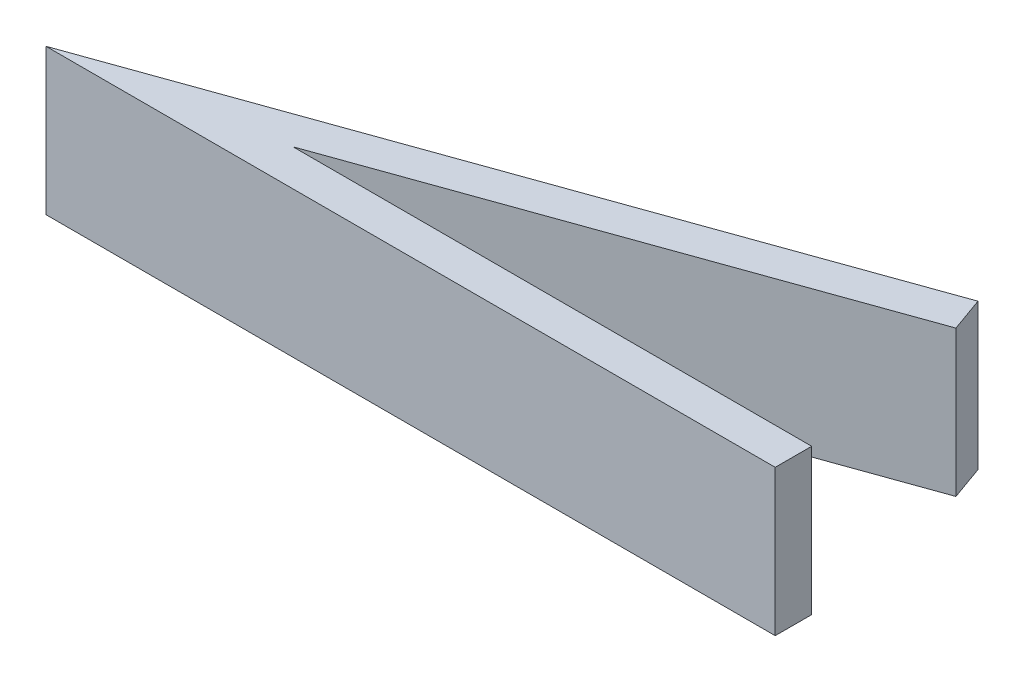
ISO-10303-21;
HEADER;
FILE_DESCRIPTION(('STEP AP214'),'2;1');
FILE_NAME('part.step','',(''),(''),'','','');
FILE_SCHEMA(('AUTOMOTIVE_DESIGN { 1 0 10303 214 1 1 1 1 }'));
ENDSEC;
DATA;
#1=APPLICATION_CONTEXT('core data for automotive mechanical design processes');
#2=APPLICATION_PROTOCOL_DEFINITION('international standard','automotive_design',2000,#1);
#3=PRODUCT_CONTEXT('',#1,'mechanical');
#4=PRODUCT('Part','Part','',(#3));
#5=PRODUCT_RELATED_PRODUCT_CATEGORY('part','',(#4));
#6=PRODUCT_DEFINITION_FORMATION('','',#4);
#7=PRODUCT_DEFINITION_CONTEXT('part definition',#1,'design');
#8=PRODUCT_DEFINITION('design','',#6,#7);
#9=PRODUCT_DEFINITION_SHAPE('','',#8);
#10=(LENGTH_UNIT() NAMED_UNIT(*) SI_UNIT(.MILLI.,.METRE.));
#11=(NAMED_UNIT(*) PLANE_ANGLE_UNIT() SI_UNIT($,.RADIAN.));
#12=(NAMED_UNIT(*) SI_UNIT($,.STERADIAN.) SOLID_ANGLE_UNIT());
#13=UNCERTAINTY_MEASURE_WITH_UNIT(LENGTH_MEASURE(1.E-05),#10,'distance_accuracy_value','');
#14=(GEOMETRIC_REPRESENTATION_CONTEXT(3) GLOBAL_UNCERTAINTY_ASSIGNED_CONTEXT((#13)) GLOBAL_UNIT_ASSIGNED_CONTEXT((#10,
#11,#12)) REPRESENTATION_CONTEXT('',''));
#15=CARTESIAN_POINT('',(0.,0.,0.));
#16=DIRECTION('',(0.,0.,1.));
#17=DIRECTION('',(1.,0.,0.));
#18=AXIS2_PLACEMENT_3D('',#15,#16,#17);
#19=CARTESIAN_POINT('',(0.,20.,0.));
#20=DIRECTION('',(0.,0.,-1.));
#21=DIRECTION('',(-1.,0.,0.));
#22=AXIS2_PLACEMENT_3D('',#19,#20,#21);
#23=PLANE('',#22);
#24=DIRECTION('',(1.,0.,0.));
#25=VECTOR('',#24,1.);
#26=CARTESIAN_POINT('',(0.,0.,0.));
#27=LINE('',#26,#25);
#28=CARTESIAN_POINT('',(-37.3203229951522,0.,0.));
#29=VERTEX_POINT('',#28);
#30=CARTESIAN_POINT('',(62.6796770048478,0.,0.));
#31=VERTEX_POINT('',#30);
#32=EDGE_CURVE('E83',#29,#31,#27,.T.);
#33=ORIENTED_EDGE('',*,*,#32,.T.);
#34=DIRECTION('',(0.,-1.,0.));
#35=VECTOR('',#34,1.);
#36=CARTESIAN_POINT('',(62.6796770048478,20.,0.));
#37=LINE('',#36,#35);
#38=CARTESIAN_POINT('',(62.6796770048478,20.,0.));
#39=VERTEX_POINT('',#38);
#40=EDGE_CURVE('E11',#39,#31,#37,.T.);
#41=ORIENTED_EDGE('',*,*,#40,.F.);
#42=DIRECTION('',(1.,0.,0.));
#43=VECTOR('',#42,1.);
#44=CARTESIAN_POINT('',(-37.3203229951522,20.,0.));
#45=LINE('',#44,#43);
#46=CARTESIAN_POINT('',(-37.3203229951522,20.,0.));
#47=VERTEX_POINT('',#46);
#48=EDGE_CURVE('E89',#47,#39,#45,.T.);
#49=ORIENTED_EDGE('',*,*,#48,.F.);
#50=DIRECTION('',(0.,-1.,0.));
#51=VECTOR('',#50,1.);
#52=CARTESIAN_POINT('',(-37.3203229951522,20.,0.));
#53=LINE('',#52,#51);
#54=EDGE_CURVE('E117',#47,#29,#53,.T.);
#55=ORIENTED_EDGE('',*,*,#54,.T.);
#56=EDGE_LOOP('',(#33,#41,#49,#55));
#57=FACE_BOUND('',#56,.T.);
#58=ADVANCED_FACE('F37',(#57),#23,.F.);
#59=CARTESIAN_POINT('',(62.6796770048478,20.,0.));
#60=DIRECTION('',(-1.,0.,0.));
#61=DIRECTION('',(0.,0.,1.));
#62=AXIS2_PLACEMENT_3D('',#59,#60,#61);
#63=PLANE('',#62);
#64=DIRECTION('',(0.,0.,-1.));
#65=VECTOR('',#64,1.);
#66=CARTESIAN_POINT('',(62.6796770048478,0.,0.));
#67=LINE('',#66,#65);
#68=CARTESIAN_POINT('',(62.6796770048478,0.,-5.));
#69=VERTEX_POINT('',#68);
#70=EDGE_CURVE('E122',#31,#69,#67,.T.);
#71=ORIENTED_EDGE('',*,*,#70,.T.);
#72=DIRECTION('',(0.,-1.,0.));
#73=VECTOR('',#72,1.);
#74=CARTESIAN_POINT('',(62.6796770048478,20.,-5.));
#75=LINE('',#74,#73);
#76=CARTESIAN_POINT('',(62.6796770048478,20.,-5.));
#77=VERTEX_POINT('',#76);
#78=EDGE_CURVE('E45',#77,#69,#75,.T.);
#79=ORIENTED_EDGE('',*,*,#78,.F.);
#80=DIRECTION('',(0.,0.,-1.));
#81=VECTOR('',#80,1.);
#82=CARTESIAN_POINT('',(62.6796770048478,20.,0.));
#83=LINE('',#82,#81);
#84=EDGE_CURVE('E144',#39,#77,#83,.T.);
#85=ORIENTED_EDGE('',*,*,#84,.F.);
#86=ORIENTED_EDGE('',*,*,#40,.T.);
#87=EDGE_LOOP('',(#71,#79,#85,#86));
#88=FACE_BOUND('',#87,.T.);
#89=ADVANCED_FACE('F147',(#88),#63,.F.);
#90=CARTESIAN_POINT('',(62.6796770048478,20.,-5.));
#91=DIRECTION('',(0.,0.,1.));
#92=DIRECTION('',(1.,0.,0.));
#93=AXIS2_PLACEMENT_3D('',#90,#91,#92);
#94=PLANE('',#93);
#95=DIRECTION('',(-1.,0.,0.));
#96=VECTOR('',#95,1.);
#97=CARTESIAN_POINT('',(62.6796770048478,0.,-5.));
#98=LINE('',#97,#96);
#99=CARTESIAN_POINT('',(-8.45425431066641,0.,-4.99999999999999));
#100=VERTEX_POINT('',#99);
#101=EDGE_CURVE('E124',#69,#100,#98,.T.);
#102=ORIENTED_EDGE('',*,*,#101,.T.);
#103=DIRECTION('',(0.,-1.,0.));
#104=VECTOR('',#103,1.);
#105=CARTESIAN_POINT('',(-8.45425431066641,20.,-4.99999999999999));
#106=LINE('',#105,#104);
#107=CARTESIAN_POINT('',(-8.45425431066641,20.,-4.99999999999999));
#108=VERTEX_POINT('',#107);
#109=EDGE_CURVE('E112',#108,#100,#106,.T.);
#110=ORIENTED_EDGE('',*,*,#109,.F.);
#111=DIRECTION('',(-1.,0.,0.));
#112=VECTOR('',#111,1.);
#113=CARTESIAN_POINT('',(62.6796770048478,20.,-5.));
#114=LINE('',#113,#112);
#115=EDGE_CURVE('E103',#77,#108,#114,.T.);
#116=ORIENTED_EDGE('',*,*,#115,.F.);
#117=ORIENTED_EDGE('',*,*,#78,.T.);
#118=EDGE_LOOP('',(#102,#110,#116,#117));
#119=FACE_BOUND('',#118,.T.);
#120=ADVANCED_FACE('F137',(#119),#94,.F.);
#121=CARTESIAN_POINT('',(-8.45425431066641,20.,-4.99999999999999));
#122=DIRECTION('',(-0.336336397687607,0.,-0.941741911348605));
#123=DIRECTION('',(-0.941741911348605,0.,0.336336397687607));
#124=AXIS2_PLACEMENT_3D('',#121,#122,#123);
#125=PLANE('',#124);
#126=DIRECTION('',(0.941741911348605,0.,-0.336336397687607));
#127=VECTOR('',#126,1.);
#128=CARTESIAN_POINT('',(-8.45425431066641,0.,-4.99999999999999));
#129=LINE('',#128,#127);
#130=CARTESIAN_POINT('',(58.5355501281463,0.,-28.9249302120177));
#131=VERTEX_POINT('',#130);
#132=EDGE_CURVE('E111',#100,#131,#129,.T.);
#133=ORIENTED_EDGE('',*,*,#132,.T.);
#134=DIRECTION('',(0.,-1.,0.));
#135=VECTOR('',#134,1.);
#136=CARTESIAN_POINT('',(58.5355501281463,20.,-28.9249302120177));
#137=LINE('',#136,#135);
#138=CARTESIAN_POINT('',(58.5355501281463,20.,-28.9249302120177));
#139=VERTEX_POINT('',#138);
#140=EDGE_CURVE('E108',#139,#131,#137,.T.);
#141=ORIENTED_EDGE('',*,*,#140,.F.);
#142=DIRECTION('',(0.941741911348605,0.,-0.336336397687607));
#143=VECTOR('',#142,1.);
#144=CARTESIAN_POINT('',(-8.45425431066641,20.,-4.99999999999999));
#145=LINE('',#144,#143);
#146=EDGE_CURVE('E97',#108,#139,#145,.T.);
#147=ORIENTED_EDGE('',*,*,#146,.F.);
#148=ORIENTED_EDGE('',*,*,#109,.T.);
#149=EDGE_LOOP('',(#133,#141,#147,#148));
#150=FACE_BOUND('',#149,.T.);
#151=ADVANCED_FACE('F109',(#150),#125,.F.);
#152=CARTESIAN_POINT('',(58.5355501281463,20.,-28.9249302120177));
#153=DIRECTION('',(-0.941741911348605,0.,0.336336397687607));
#154=DIRECTION('',(0.336336397687607,0.,0.941741911348605));
#155=AXIS2_PLACEMENT_3D('',#152,#153,#154);
#156=PLANE('',#155);
#157=DIRECTION('',(-0.336336397687607,0.,-0.941741911348605));
#158=VECTOR('',#157,1.);
#159=CARTESIAN_POINT('',(58.5355501281463,0.,-28.9249302120177));
#160=LINE('',#159,#158);
#161=CARTESIAN_POINT('',(56.8538681397083,0.,-33.6336397687608));
#162=VERTEX_POINT('',#161);
#163=EDGE_CURVE('E76',#131,#162,#160,.T.);
#164=ORIENTED_EDGE('',*,*,#163,.T.);
#165=DIRECTION('',(0.,-1.,0.));
#166=VECTOR('',#165,1.);
#167=CARTESIAN_POINT('',(56.8538681397083,20.,-33.6336397687608));
#168=LINE('',#167,#166);
#169=CARTESIAN_POINT('',(56.8538681397083,20.,-33.6336397687608));
#170=VERTEX_POINT('',#169);
#171=EDGE_CURVE('E113',#170,#162,#168,.T.);
#172=ORIENTED_EDGE('',*,*,#171,.F.);
#173=DIRECTION('',(-0.336336397687607,0.,-0.941741911348605));
#174=VECTOR('',#173,1.);
#175=CARTESIAN_POINT('',(58.5355501281463,20.,-28.9249302120177));
#176=LINE('',#175,#174);
#177=EDGE_CURVE('E101',#139,#170,#176,.T.);
#178=ORIENTED_EDGE('',*,*,#177,.F.);
#179=ORIENTED_EDGE('',*,*,#140,.T.);
#180=EDGE_LOOP('',(#164,#172,#178,#179));
#181=FACE_BOUND('',#180,.T.);
#182=ADVANCED_FACE('F115',(#181),#156,.F.);
#183=CARTESIAN_POINT('',(56.8538681397083,20.,-33.6336397687608));
#184=DIRECTION('',(0.336336397687608,0.,0.941741911348605));
#185=DIRECTION('',(0.941741911348605,0.,-0.336336397687608));
#186=AXIS2_PLACEMENT_3D('',#183,#184,#185);
#187=PLANE('',#186);
#188=DIRECTION('',(-0.941741911348605,0.,0.336336397687608));
#189=VECTOR('',#188,1.);
#190=CARTESIAN_POINT('',(56.8538681397083,0.,-33.6336397687608));
#191=LINE('',#190,#189);
#192=EDGE_CURVE('E128',#162,#29,#191,.T.);
#193=ORIENTED_EDGE('',*,*,#192,.T.);
#194=ORIENTED_EDGE('',*,*,#54,.F.);
#195=DIRECTION('',(-0.941741911348605,0.,0.336336397687608));
#196=VECTOR('',#195,1.);
#197=CARTESIAN_POINT('',(56.8538681397083,20.,-33.6336397687608));
#198=LINE('',#197,#196);
#199=EDGE_CURVE('E53',#170,#47,#198,.T.);
#200=ORIENTED_EDGE('',*,*,#199,.F.);
#201=ORIENTED_EDGE('',*,*,#171,.T.);
#202=EDGE_LOOP('',(#193,#194,#200,#201));
#203=FACE_BOUND('',#202,.T.);
#204=ADVANCED_FACE('F142',(#203),#187,.F.);
#205=CARTESIAN_POINT('',(0.,20.,0.));
#206=DIRECTION('',(0.,1.,0.));
#207=DIRECTION('',(0.,0.,1.));
#208=AXIS2_PLACEMENT_3D('',#205,#206,#207);
#209=PLANE('',#208);
#210=ORIENTED_EDGE('',*,*,#48,.T.);
#211=ORIENTED_EDGE('',*,*,#84,.T.);
#212=ORIENTED_EDGE('',*,*,#115,.T.);
#213=ORIENTED_EDGE('',*,*,#146,.T.);
#214=ORIENTED_EDGE('',*,*,#177,.T.);
#215=ORIENTED_EDGE('',*,*,#199,.T.);
#216=EDGE_LOOP('',(#210,#211,#212,#213,#214,#215));
#217=FACE_BOUND('',#216,.T.);
#218=ADVANCED_FACE('F99',(#217),#209,.T.);
#219=CARTESIAN_POINT('',(0.,0.,0.));
#220=DIRECTION('',(0.,1.,0.));
#221=DIRECTION('',(0.,0.,1.));
#222=AXIS2_PLACEMENT_3D('',#219,#220,#221);
#223=PLANE('',#222);
#224=ORIENTED_EDGE('',*,*,#32,.F.);
#225=ORIENTED_EDGE('',*,*,#192,.F.);
#226=ORIENTED_EDGE('',*,*,#163,.F.);
#227=ORIENTED_EDGE('',*,*,#132,.F.);
#228=ORIENTED_EDGE('',*,*,#101,.F.);
#229=ORIENTED_EDGE('',*,*,#70,.F.);
#230=EDGE_LOOP('',(#224,#225,#226,#227,#228,#229));
#231=FACE_BOUND('',#230,.T.);
#232=ADVANCED_FACE('F140',(#231),#223,.F.);
#233=CLOSED_SHELL('',(#58,#89,#120,#151,#182,#204,#218,#232));
#234=MANIFOLD_SOLID_BREP('B2',#233);
#235=ADVANCED_BREP_SHAPE_REPRESENTATION('',(#18,#234),#14);
#236=SHAPE_DEFINITION_REPRESENTATION(#9,#235);
ENDSEC;
END-ISO-10303-21;
